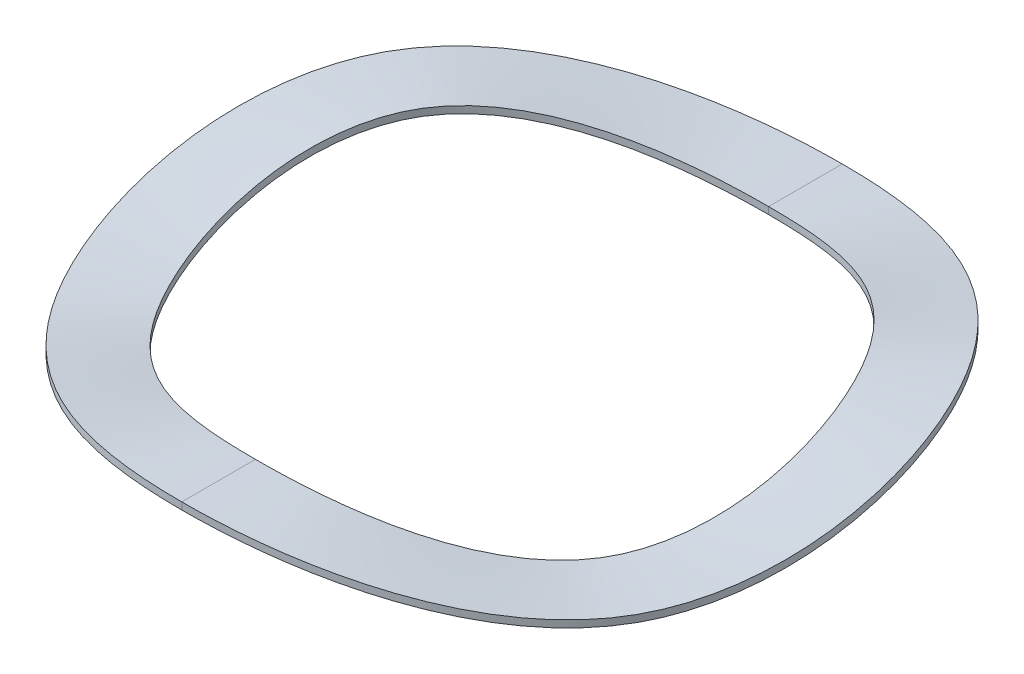
ISO-10303-21;
HEADER;
FILE_DESCRIPTION(('STEP AP214'),'2;1');
FILE_NAME('part.step','',(''),(''),'','','');
FILE_SCHEMA(('AUTOMOTIVE_DESIGN { 1 0 10303 214 1 1 1 1 }'));
ENDSEC;
DATA;
#1=APPLICATION_CONTEXT('core data for automotive mechanical design processes');
#2=APPLICATION_PROTOCOL_DEFINITION('international standard','automotive_design',2000,#1);
#3=PRODUCT_CONTEXT('',#1,'mechanical');
#4=PRODUCT('Part','Part','',(#3));
#5=PRODUCT_RELATED_PRODUCT_CATEGORY('part','',(#4));
#6=PRODUCT_DEFINITION_FORMATION('','',#4);
#7=PRODUCT_DEFINITION_CONTEXT('part definition',#1,'design');
#8=PRODUCT_DEFINITION('design','',#6,#7);
#9=PRODUCT_DEFINITION_SHAPE('','',#8);
#10=(LENGTH_UNIT() NAMED_UNIT(*) SI_UNIT(.MILLI.,.METRE.));
#11=(NAMED_UNIT(*) PLANE_ANGLE_UNIT() SI_UNIT($,.RADIAN.));
#12=(NAMED_UNIT(*) SI_UNIT($,.STERADIAN.) SOLID_ANGLE_UNIT());
#13=UNCERTAINTY_MEASURE_WITH_UNIT(LENGTH_MEASURE(1.E-05),#10,'distance_accuracy_value','');
#14=(GEOMETRIC_REPRESENTATION_CONTEXT(3) GLOBAL_UNCERTAINTY_ASSIGNED_CONTEXT((#13)) GLOBAL_UNIT_ASSIGNED_CONTEXT((#10,
#11,#12)) REPRESENTATION_CONTEXT('',''));
#15=CARTESIAN_POINT('',(0.,0.,0.));
#16=DIRECTION('',(0.,0.,1.));
#17=DIRECTION('',(1.,0.,0.));
#18=AXIS2_PLACEMENT_3D('',#15,#16,#17);
#19=CARTESIAN_POINT('',(0.224188784215286,1.56013019364219,10.5914410143578));
#20=CARTESIAN_POINT('',(0.246642242252223,1.56013019364219,11.6522187744871));
#21=CARTESIAN_POINT('',(0.269095700289108,1.56013019364219,12.712996534619));
#22=CARTESIAN_POINT('',(0.291549158325968,1.56013019364219,13.7737742947509));
#23=CARTESIAN_POINT('',(0.149469520383755,1.56145219262379,10.5932073203959));
#24=CARTESIAN_POINT('',(0.164439527092526,1.56145219262379,11.65416198357));
#25=CARTESIAN_POINT('',(0.179409533801297,1.56145219262379,12.7151166467466));
#26=CARTESIAN_POINT('',(0.194379540510068,1.56145219262379,13.7760713099232));
#27=CARTESIAN_POINT('',(-3.59516428215896,1.59391100285005,10.6372341339144));
#28=CARTESIAN_POINT('',(-3.95523524033666,1.59391100285005,11.7025982692829));
#29=CARTESIAN_POINT('',(-4.3153061985169,1.59391100285005,12.7679624046515));
#30=CARTESIAN_POINT('',(-4.6753771566946,1.59391100285005,13.8333265400201));
#31=CARTESIAN_POINT('',(-11.0096971270514,-1.5621,6.3564516));
#32=CARTESIAN_POINT('',(-12.1123650116503,-1.5621,6.9930772));
#33=CARTESIAN_POINT('',(-13.2150328962517,-1.5621,7.6297028));
#34=CARTESIAN_POINT('',(-14.3177007808505,-1.5621,8.2663284));
#35=CARTESIAN_POINT('',(-11.0096971270514,3.1242,-6.3564516));
#36=CARTESIAN_POINT('',(-12.1123650116503,3.1242,-6.9930772));
#37=CARTESIAN_POINT('',(-13.2150328962517,3.1242,-7.6297028));
#38=CARTESIAN_POINT('',(-14.3177007808505,3.1242,-8.2663284));
#39=CARTESIAN_POINT('',(-3.59516423812044,-0.0318110215952794,-10.6372341593398));
#40=CARTESIAN_POINT('',(-3.9552351918887,-0.0318110215952794,-11.702598297256));
#41=CARTESIAN_POINT('',(-4.31530614565696,-0.0318110215952794,-12.7679624351696));
#42=CARTESIAN_POINT('',(-4.67537709942522,-0.0318110215952794,-13.8333265730832));
#43=CARTESIAN_POINT('',(0.149469608461328,0.000647808139641734,-10.5932073193596));
#44=CARTESIAN_POINT('',(0.164439623991443,0.000647808139641734,-11.6541619824321));
#45=CARTESIAN_POINT('',(0.179409639521558,0.00064780813964148,-12.7151166455045));
#46=CARTESIAN_POINT('',(0.194379655051673,0.00064780813964148,-13.7760713085744));
#47=CARTESIAN_POINT('',(0.224188916304278,0.00196980869486241,-10.5914410112336));
#48=CARTESIAN_POINT('',(0.246642387570474,0.00196980869486241,-11.6522187710531));
#49=CARTESIAN_POINT('',(0.26909585883667,0.00196980869486216,-12.7129965308725));
#50=CARTESIAN_POINT('',(0.291549330102866,0.00196980869486216,-13.7737742906894));
#51=B_SPLINE_SURFACE_WITH_KNOTS('',3,3,((#19,#20,#21,#22),(#23,#24,#25,#26),(#27,#28,#29,#30),
(#31,#32,#33,#34),(#35,#36,#37,#38),(#39,#40,#41,#42),(#43,#44,#45,#46),(#47,#48,#49,#50)),
.UNSPECIFIED.,.F.,.F.,.F.,(4,1,1,1,1,4),(4,4),(-0.00678808502445,0.,0.3333333333333,
0.6666666666667,1.,1.006788089024),(-0.02,1.02),.UNSPECIFIED.);
#52=CARTESIAN_POINT('',(0.184156371888475,1.56132448153225,13.7146292397519));
#53=CARTESIAN_POINT('',(0.122774330257402,1.5618392479152,13.7155420939003));
#54=CARTESIAN_POINT('',(-4.68997461019458,1.58228219095533,13.7514418963119));
#55=CARTESIAN_POINT('',(-14.2540853259684,-1.5621,8.2296));
#56=CARTESIAN_POINT('',(-14.2540853259684,3.12420000000004,-8.2296));
#57=CARTESIAN_POINT('',(-4.68997461019458,-0.0201821909553515,-13.7514418963119));
#58=CARTESIAN_POINT('',(0.122774330257402,0.000260752084858521,-13.7155420939003));
#59=CARTESIAN_POINT('',(0.184156371888475,0.000775518467790328,-13.7146292397519));
#60=B_SPLINE_CURVE_WITH_KNOTS('',3,(#52,#53,#54,#55,#56,#57,#58,#59),.UNSPECIFIED.,.F.,.F.,(4,1,
1,1,1,4),(0.4978466817153,0.5,0.6666666666667,0.8333333333333,1.,1.002153318285),.UNSPECIFIED.);
#61=CARTESIAN_POINT('',(0.,0.,-13.7160000000005));
#62=VERTEX_POINT('',#61);
#63=CARTESIAN_POINT('',(-4.81075523399174E-08,1.5621,13.7160000000005));
#64=VERTEX_POINT('',#63);
#65=EDGE_CURVE('E22',#62,#64,#60,.F.);
#66=DIRECTION('',(0.,0.,1.));
#67=VECTOR('',#66,1.);
#68=CARTESIAN_POINT('',(0.,0.,-12.18565));
#69=LINE('',#68,#67);
#70=CARTESIAN_POINT('',(0.,0.,-10.6553000000007));
#71=VERTEX_POINT('',#70);
#72=EDGE_CURVE('E73',#62,#71,#69,.T.);
#73=CARTESIAN_POINT('',(0.112747999612567,1.56161744192605,10.6546383064847));
#74=CARTESIAN_POINT('',(0.0751666319023766,1.56193804796379,10.6550790605562));
#75=CARTESIAN_POINT('',(-3.65352087802618,1.57800551086132,10.6769987375803));
#76=CARTESIAN_POINT('',(-11.0733125819335,-1.56209999999994,6.39318));
#77=CARTESIAN_POINT('',(-11.0733125819335,3.1242000000001,-6.39318));
#78=CARTESIAN_POINT('',(-3.65352087802618,-0.0159055108612102,-10.6769987375803));
#79=CARTESIAN_POINT('',(0.0751666319023766,0.000161952036260977,-10.6550790605562));
#80=CARTESIAN_POINT('',(0.112747999612567,0.000482558074143377,-10.6546383064847));
#81=B_SPLINE_CURVE_WITH_KNOTS('',3,(#73,#74,#75,#76,#77,#78,#79,#80),.UNSPECIFIED.,.F.,.F.,(4,1,
1,1,1,4),(0.4983029777371,0.5,0.6666666666667,0.8333333333333,1.,1.001697022263),.UNSPECIFIED.);
#82=CARTESIAN_POINT('',(-4.98299081496668E-08,1.56209999999998,10.6553000000007));
#83=VERTEX_POINT('',#82);
#84=EDGE_CURVE('E65',#83,#71,#81,.T.);
#85=DIRECTION('',(-4.6765521799251E-09,0.,1.));
#86=VECTOR('',#85,1.);
#87=CARTESIAN_POINT('',(-5.69866692622103E-08,1.56210000000001,12.18565));
#88=LINE('',#87,#86);
#89=EDGE_CURVE('E71',#83,#64,#88,.T.);
#90=ORIENTED_EDGE('',*,*,#65,.F.);
#91=ORIENTED_EDGE('',*,*,#72,.T.);
#92=ORIENTED_EDGE('',*,*,#84,.F.);
#93=ORIENTED_EDGE('',*,*,#89,.T.);
#94=EDGE_LOOP('',(#90,#91,#92,#93));
#95=FACE_BOUND('',#94,.T.);
#96=ADVANCED_FACE('F16',(#95),#51,.F.);
#97=CARTESIAN_POINT('',(0.184156371888475,1.55548248153224,13.7146292397519));
#98=CARTESIAN_POINT('',(0.122774330257402,1.55599724791521,13.7155420939003));
#99=CARTESIAN_POINT('',(-4.68997461019458,1.57644019095532,13.7514418963119));
#100=CARTESIAN_POINT('',(-14.2540853259684,-1.567942,8.2296));
#101=CARTESIAN_POINT('',(-14.2540853259684,3.118358,-8.2296));
#102=CARTESIAN_POINT('',(-4.68997461019458,-0.0260241909553494,-13.7514418963119));
#103=CARTESIAN_POINT('',(0.122774330257402,-0.00558124791513996,-13.7155420939003));
#104=CARTESIAN_POINT('',(0.184156371888475,-0.00506648153220844,-13.7146292397519));
#105=CARTESIAN_POINT('',(0.184156371888475,1.65674381486566,13.7146292397519));
#106=CARTESIAN_POINT('',(0.122774330257402,1.65725858124837,13.7155420939003));
#107=CARTESIAN_POINT('',(-4.68997461019458,1.67770152428874,13.7514418963119));
#108=CARTESIAN_POINT('',(-14.2540853259684,-1.46668066666658,8.2296));
#109=CARTESIAN_POINT('',(-14.2540853259684,3.21961933333418,-8.2296));
#110=CARTESIAN_POINT('',(-4.68997461019458,0.075237142377967,-13.7514418963119));
#111=CARTESIAN_POINT('',(0.122774330257402,0.0956800854181866,-13.7155420939003));
#112=CARTESIAN_POINT('',(0.184156371888475,0.0961948518011232,-13.7146292397519));
#113=CARTESIAN_POINT('',(0.184156371888475,1.75800514819883,13.7146292397519));
#114=CARTESIAN_POINT('',(0.122774330257402,1.75851991458179,13.7155420939003));
#115=CARTESIAN_POINT('',(-4.68997461019458,1.77896285762191,13.7514418963119));
#116=CARTESIAN_POINT('',(-14.2540853259684,-1.36541933333342,8.2296));
#117=CARTESIAN_POINT('',(-14.2540853259684,3.32088066666582,-8.2296));
#118=CARTESIAN_POINT('',(-4.68997461019458,0.176498475711309,-13.7514418963119));
#119=CARTESIAN_POINT('',(0.122774330257402,0.196941418751528,-13.7155420939003));
#120=CARTESIAN_POINT('',(0.184156371888475,0.197456185134465,-13.7146292397519));
#121=CARTESIAN_POINT('',(0.184156371888475,1.85926648153224,13.7146292397519));
#122=CARTESIAN_POINT('',(0.122774330257402,1.85978124791521,13.7155420939003));
#123=CARTESIAN_POINT('',(-4.68997461019458,1.88022419095532,13.7514418963119));
#124=CARTESIAN_POINT('',(-14.2540853259684,-1.264158,8.2296));
#125=CARTESIAN_POINT('',(-14.2540853259684,3.422142,-8.2296));
#126=CARTESIAN_POINT('',(-4.68997461019458,0.277759809044676,-13.7514418963119));
#127=CARTESIAN_POINT('',(0.122774330257402,0.298202752084794,-13.7155420939003));
#128=CARTESIAN_POINT('',(0.184156371888475,0.298717518467756,-13.7146292397519));
#129=B_SPLINE_SURFACE_WITH_KNOTS('',3,3,((#97,#98,#99,#100,#101,#102,#103,#104),(#105,#106,#107,
#108,#109,#110,#111,#112),(#113,#114,#115,#116,#117,#118,#119,#120),(#121,#122,#123,#124,#125,
#126,#127,#128)),.UNSPECIFIED.,.F.,.F.,.F.,(4,4),(4,1,1,1,1,4),(-0.02,1.02),(0.4978466817153,
0.5,0.6666666666667,0.8333333333333,1.,1.002153318285),.UNSPECIFIED.);
#130=DIRECTION('',(0.,-1.,0.));
#131=VECTOR('',#130,1.);
#132=CARTESIAN_POINT('',(0.,0.146049999999991,-13.7160000000005));
#133=LINE('',#132,#131);
#134=CARTESIAN_POINT('',(0.,0.292099999999941,-13.7160000000005));
#135=VERTEX_POINT('',#134);
#136=EDGE_CURVE('E38',#135,#62,#133,.T.);
#137=DIRECTION('',(0.,1.,0.));
#138=VECTOR('',#137,1.);
#139=CARTESIAN_POINT('',(-4.27622595601009E-08,1.70814999999997,13.7160000000005));
#140=LINE('',#139,#138);
#141=CARTESIAN_POINT('',(-4.27622595601009E-08,1.85420000000006,13.7160000000005));
#142=VERTEX_POINT('',#141);
#143=EDGE_CURVE('E60',#64,#142,#140,.T.);
#144=CARTESIAN_POINT('',(0.184156371888475,1.85342448153218,13.7146292397519));
#145=CARTESIAN_POINT('',(0.122774330257402,1.85393924791514,13.7155420939003));
#146=CARTESIAN_POINT('',(-4.68997461019458,1.87438219095526,13.7514418963119));
#147=CARTESIAN_POINT('',(-14.2540853259684,-1.27000000000006,8.2296));
#148=CARTESIAN_POINT('',(-14.2540853259684,3.41629999999989,-8.2296));
#149=CARTESIAN_POINT('',(-4.68997461019458,0.271917809044616,-13.7514418963119));
#150=CARTESIAN_POINT('',(0.122774330257402,0.292360752084739,-13.7155420939003));
#151=CARTESIAN_POINT('',(0.184156371888475,0.2928755184677,-13.7146292397519));
#152=B_SPLINE_CURVE_WITH_KNOTS('',3,(#144,#145,#146,#147,#148,#149,#150,#151),.UNSPECIFIED.,.F.,
.F.,(4,1,1,1,1,4),(0.4978466817153,0.5,0.6666666666667,0.8333333333333,1.,1.002153318285),.UNSPECIFIED.);
#153=EDGE_CURVE('E108',#142,#135,#152,.T.);
#154=ORIENTED_EDGE('',*,*,#136,.T.);
#155=ORIENTED_EDGE('',*,*,#65,.T.);
#156=ORIENTED_EDGE('',*,*,#143,.T.);
#157=ORIENTED_EDGE('',*,*,#153,.T.);
#158=EDGE_LOOP('',(#154,#155,#156,#157));
#159=FACE_BOUND('',#158,.T.);
#160=ADVANCED_FACE('F58',(#159),#129,.T.);
#161=CARTESIAN_POINT('',(0.112747999612567,1.859559441926,10.6546383064847));
#162=CARTESIAN_POINT('',(0.0751666319023766,1.85988004796373,10.6550790605562));
#163=CARTESIAN_POINT('',(-3.65352087802618,1.87594751086125,10.6769987375803));
#164=CARTESIAN_POINT('',(-11.0733125819335,-1.264158,6.39318));
#165=CARTESIAN_POINT('',(-11.0733125819335,3.422142,-6.39318));
#166=CARTESIAN_POINT('',(-3.65352087802618,0.282036489138746,-10.6769987375803));
#167=CARTESIAN_POINT('',(0.0751666319023766,0.298103952036268,-10.6550790605562));
#168=CARTESIAN_POINT('',(0.112747999612567,0.298424558073998,-10.6546383064847));
#169=CARTESIAN_POINT('',(0.112747999612567,1.75829810859258,10.6546383064847));
#170=CARTESIAN_POINT('',(0.0751666319023766,1.75861871463057,10.6550790605562));
#171=CARTESIAN_POINT('',(-3.65352087802618,1.77468617752784,10.6769987375803));
#172=CARTESIAN_POINT('',(-11.0733125819335,-1.36541933333342,6.39318));
#173=CARTESIAN_POINT('',(-11.0733125819335,3.32088066666582,-6.39318));
#174=CARTESIAN_POINT('',(-3.65352087802618,0.180775155805404,-10.6769987375803));
#175=CARTESIAN_POINT('',(0.0751666319023766,0.196842618702875,-10.6550790605562));
#176=CARTESIAN_POINT('',(0.112747999612567,0.197163224740758,-10.6546383064847));
#177=CARTESIAN_POINT('',(0.112747999612567,1.65703677525917,10.6546383064847));
#178=CARTESIAN_POINT('',(0.0751666319023766,1.65735738129715,10.6550790605562));
#179=CARTESIAN_POINT('',(-3.65352087802618,1.67342484419467,10.6769987375803));
#180=CARTESIAN_POINT('',(-11.0733125819335,-1.46668066666658,6.39318));
#181=CARTESIAN_POINT('',(-11.0733125819335,3.21961933333418,-6.39318));
#182=CARTESIAN_POINT('',(-3.65352087802618,0.0795138224720624,-10.6769987375803));
#183=CARTESIAN_POINT('',(0.0751666319023766,0.0955812853695336,-10.6550790605562));
#184=CARTESIAN_POINT('',(0.112747999612567,0.095901891407416,-10.6546383064847));
#185=CARTESIAN_POINT('',(0.112747999612567,1.555775441926,10.6546383064847));
#186=CARTESIAN_POINT('',(0.0751666319023766,1.55609604796373,10.6550790605562));
#187=CARTESIAN_POINT('',(-3.65352087802618,1.57216351086125,10.6769987375803));
#188=CARTESIAN_POINT('',(-11.0733125819335,-1.567942,6.39318));
#189=CARTESIAN_POINT('',(-11.0733125819335,3.118358,-6.39318));
#190=CARTESIAN_POINT('',(-3.65352087802618,-0.0217475108612667,-10.6769987375803));
#191=CARTESIAN_POINT('',(0.0751666319023766,-0.0056800479637955,-10.6550790605562));
#192=CARTESIAN_POINT('',(0.112747999612567,-0.0053594419259131,-10.6546383064847));
#193=B_SPLINE_SURFACE_WITH_KNOTS('',3,3,((#161,#162,#163,#164,#165,#166,#167,#168),(#169,#170,
#171,#172,#173,#174,#175,#176),(#177,#178,#179,#180,#181,#182,#183,#184),(#185,#186,#187,#188,
#189,#190,#191,#192)),.UNSPECIFIED.,.F.,.F.,.F.,(4,4),(4,1,1,1,1,4),(-0.02,1.02),
(0.4983029777371,0.5,0.6666666666667,0.8333333333333,1.,1.001697022263),.UNSPECIFIED.);
#194=DIRECTION('',(0.,-1.,0.));
#195=VECTOR('',#194,1.);
#196=CARTESIAN_POINT('',(0.,0.146050000000006,-10.6553000000007));
#197=LINE('',#196,#195);
#198=CARTESIAN_POINT('',(0.,0.292100000000058,-10.6553000000007));
#199=VERTEX_POINT('',#198);
#200=EDGE_CURVE('E122',#199,#71,#197,.T.);
#201=CARTESIAN_POINT('',(0.112747999612567,1.85371744192594,10.6546383064847));
#202=CARTESIAN_POINT('',(0.0751666319023766,1.85403804796368,10.6550790605562));
#203=CARTESIAN_POINT('',(-3.65352087802618,1.87010551086119,10.6769987375803));
#204=CARTESIAN_POINT('',(-11.0733125819335,-1.27000000000006,6.39318));
#205=CARTESIAN_POINT('',(-11.0733125819335,3.4162999999999,-6.39318));
#206=CARTESIAN_POINT('',(-3.65352087802618,0.276194489138688,-10.6769987375803));
#207=CARTESIAN_POINT('',(0.0751666319023766,0.292261952036207,-10.6550790605562));
#208=CARTESIAN_POINT('',(0.112747999612567,0.292582558073946,-10.6546383064847));
#209=B_SPLINE_CURVE_WITH_KNOTS('',3,(#201,#202,#203,#204,#205,#206,#207,#208),.UNSPECIFIED.,.F.,
.F.,(4,1,1,1,1,4),(0.4983029777371,0.5,0.6666666666667,0.8333333333333,1.,1.001697022263),.UNSPECIFIED.);
#210=CARTESIAN_POINT('',(-4.15249231910151E-08,1.85419999999995,10.6553000000007));
#211=VERTEX_POINT('',#210);
#212=EDGE_CURVE('E75',#199,#211,#209,.F.);
#213=DIRECTION('',(0.,1.,0.));
#214=VECTOR('',#213,1.);
#215=CARTESIAN_POINT('',(-4.98299084420518E-08,1.70815000000003,10.6553000000007));
#216=LINE('',#215,#214);
#217=EDGE_CURVE('E115',#83,#211,#216,.T.);
#218=ORIENTED_EDGE('',*,*,#200,.F.);
#219=ORIENTED_EDGE('',*,*,#212,.T.);
#220=ORIENTED_EDGE('',*,*,#217,.F.);
#221=ORIENTED_EDGE('',*,*,#84,.T.);
#222=EDGE_LOOP('',(#218,#219,#220,#221));
#223=FACE_BOUND('',#222,.T.);
#224=ADVANCED_FACE('F134',(#223),#193,.T.);
#225=CARTESIAN_POINT('',(-0.224188917200898,0.00196980871072624,-10.5914410112133));
#226=CARTESIAN_POINT('',(-0.246642388556908,0.00196980871072624,-11.6522187710302));
#227=CARTESIAN_POINT('',(-0.269095859912868,0.00196980871072624,-12.7129965308471));
#228=CARTESIAN_POINT('',(-0.29154933126898,0.00196980871072649,-13.7737742906615));
#229=CARTESIAN_POINT('',(-0.149469609059193,0.000647808144823842,-10.593207319352));
#230=CARTESIAN_POINT('',(-0.164439624649201,0.000647808144824096,-11.6541619824244));
#231=CARTESIAN_POINT('',(-0.179409640239209,0.000647808144824096,-12.7151166454944));
#232=CARTESIAN_POINT('',(-0.194379655829192,0.000647808144824096,-13.7760713085668));
#233=CARTESIAN_POINT('',(3.59516423782072,-0.031811021722508,-10.6372341595125));
#234=CARTESIAN_POINT('',(3.9552351915585,-0.031811021722508,-11.7025982974439));
#235=CARTESIAN_POINT('',(4.31530614529628,-0.031811021722508,-12.7679624353779));
#236=CARTESIAN_POINT('',(4.67537709903406,-0.031811021722508,-13.8333265733093));
#237=CARTESIAN_POINT('',(11.0096971270514,3.1242,-6.3564516));
#238=CARTESIAN_POINT('',(12.1123650116503,3.1242,-6.9930772));
#239=CARTESIAN_POINT('',(13.2150328962517,3.1242,-7.6297028));
#240=CARTESIAN_POINT('',(14.3177007808505,3.1242,-8.2663284));
#241=CARTESIAN_POINT('',(11.0096971270514,-1.5621,6.3564516));
#242=CARTESIAN_POINT('',(12.1123650116503,-1.5621,6.9930772));
#243=CARTESIAN_POINT('',(13.2150328962517,-1.5621,7.6297028));
#244=CARTESIAN_POINT('',(14.3177007808505,-1.5621,8.2663284));
#245=CARTESIAN_POINT('',(3.59516423782072,1.59391102172251,10.6372341595125));
#246=CARTESIAN_POINT('',(3.9552351915585,1.59391102172251,11.7025982974439));
#247=CARTESIAN_POINT('',(4.31530614529628,1.59391102172251,12.7679624353779));
#248=CARTESIAN_POINT('',(4.67537709903406,1.59391102172251,13.8333265733093));
#249=CARTESIAN_POINT('',(-0.149469609059193,1.56145219185518,10.593207319352));
#250=CARTESIAN_POINT('',(-0.164439624649201,1.56145219185518,11.6541619824244));
#251=CARTESIAN_POINT('',(-0.179409640239209,1.56145219185518,12.7151166454944));
#252=CARTESIAN_POINT('',(-0.194379655829192,1.56145219185518,13.7760713085668));
#253=CARTESIAN_POINT('',(-0.224188917200898,1.56013019128938,10.5914410112133));
#254=CARTESIAN_POINT('',(-0.246642388556883,1.56013019128938,11.6522187710302));
#255=CARTESIAN_POINT('',(-0.269095859912868,1.56013019128938,12.7129965308471));
#256=CARTESIAN_POINT('',(-0.29154933126898,1.56013019128938,13.7737742906615));
#257=B_SPLINE_SURFACE_WITH_KNOTS('',3,3,((#225,#226,#227,#228),(#229,#230,#231,#232),(#233,#234,
#235,#236),(#237,#238,#239,#240),(#241,#242,#243,#244),(#245,#246,#247,#248),(#249,#250,#251,
#252),(#253,#254,#255,#256)),.UNSPECIFIED.,.F.,.F.,.F.,(4,1,1,1,1,4),(4,4),(-0.006788089051602,
0.,0.3333333333333,0.6666666666667,1.,1.006788089052),(-0.02,1.02),.UNSPECIFIED.);
#258=CARTESIAN_POINT('',(-0.18415637188845,0.000775518467738626,-13.7146292397519));
#259=CARTESIAN_POINT('',(-0.122774330257402,0.000260752084804422,-13.7155420939003));
#260=CARTESIAN_POINT('',(4.68997461019458,-0.0201821909554032,-13.7514418963119));
#261=CARTESIAN_POINT('',(14.2540853259684,3.12419999999999,-8.2296));
#262=CARTESIAN_POINT('',(14.2540853259684,-1.56210000000005,8.2296));
#263=CARTESIAN_POINT('',(4.68997461019458,1.58228219095528,13.7514418963119));
#264=CARTESIAN_POINT('',(-0.122774330257402,1.56183924791514,13.7155420939003));
#265=CARTESIAN_POINT('',(-0.18415637188845,1.5613244815322,13.7146292397519));
#266=B_SPLINE_CURVE_WITH_KNOTS('',3,(#258,#259,#260,#261,#262,#263,#264,#265),.UNSPECIFIED.,.F.,
.F.,(4,1,1,1,1,4),(-0.002153318284719,0.,0.1666666666667,0.3333333333333,0.5,0.5021533182847),.UNSPECIFIED.);
#267=EDGE_CURVE('E68',#64,#62,#266,.F.);
#268=CARTESIAN_POINT('',(-0.112747999612567,0.000482558074088672,-10.6546383064847));
#269=CARTESIAN_POINT('',(-0.0751666319023766,0.000161952036206273,-10.6550790605562));
#270=CARTESIAN_POINT('',(3.65352087802618,-0.0159055108612601,-10.6769987375803));
#271=CARTESIAN_POINT('',(11.0733125819335,3.12420000000005,-6.39318));
#272=CARTESIAN_POINT('',(11.0733125819335,-1.56209999999999,6.39318));
#273=CARTESIAN_POINT('',(3.65352087802618,1.57800551086126,10.6769987375803));
#274=CARTESIAN_POINT('',(-0.075166631902402,1.56193804796374,10.6550790605562));
#275=CARTESIAN_POINT('',(-0.112747999612592,1.56161744192599,10.6546383064847));
#276=B_SPLINE_CURVE_WITH_KNOTS('',3,(#268,#269,#270,#271,#272,#273,#274,#275),.UNSPECIFIED.,.F.,
.F.,(4,1,1,1,1,4),(-0.001697022262901,0.,0.1666666666667,0.3333333333333,0.5,0.5016970222629),.UNSPECIFIED.);
#277=EDGE_CURVE('E116',#71,#83,#276,.T.);
#278=ORIENTED_EDGE('',*,*,#72,.F.);
#279=ORIENTED_EDGE('',*,*,#267,.F.);
#280=ORIENTED_EDGE('',*,*,#89,.F.);
#281=ORIENTED_EDGE('',*,*,#277,.F.);
#282=EDGE_LOOP('',(#278,#279,#280,#281));
#283=FACE_BOUND('',#282,.T.);
#284=ADVANCED_FACE('F69',(#283),#257,.F.);
#285=CARTESIAN_POINT('',(-0.112747999612567,0.298424558073998,-10.6546383064847));
#286=CARTESIAN_POINT('',(-0.0751666319023766,0.298103952036268,-10.6550790605562));
#287=CARTESIAN_POINT('',(3.65352087802618,0.282036489138746,-10.6769987375803));
#288=CARTESIAN_POINT('',(11.0733125819335,3.422142,-6.39318));
#289=CARTESIAN_POINT('',(11.0733125819335,-1.264158,6.39318));
#290=CARTESIAN_POINT('',(3.65352087802618,1.87594751086125,10.6769987375803));
#291=CARTESIAN_POINT('',(-0.075166631902402,1.85988004796373,10.6550790605562));
#292=CARTESIAN_POINT('',(-0.112747999612592,1.859559441926,10.6546383064847));
#293=CARTESIAN_POINT('',(-0.112747999612567,0.197163224740758,-10.6546383064847));
#294=CARTESIAN_POINT('',(-0.0751666319023766,0.196842618702875,-10.6550790605562));
#295=CARTESIAN_POINT('',(3.65352087802618,0.180775155805404,-10.6769987375803));
#296=CARTESIAN_POINT('',(11.0733125819335,3.32088066666582,-6.39318));
#297=CARTESIAN_POINT('',(11.0733125819335,-1.36541933333342,6.39318));
#298=CARTESIAN_POINT('',(3.65352087802618,1.77468617752784,10.6769987375803));
#299=CARTESIAN_POINT('',(-0.075166631902402,1.75861871463057,10.6550790605562));
#300=CARTESIAN_POINT('',(-0.112747999612592,1.75829810859258,10.6546383064847));
#301=CARTESIAN_POINT('',(-0.112747999612567,0.095901891407416,-10.6546383064847));
#302=CARTESIAN_POINT('',(-0.0751666319023766,0.0955812853695336,-10.6550790605562));
#303=CARTESIAN_POINT('',(3.65352087802618,0.0795138224720624,-10.6769987375803));
#304=CARTESIAN_POINT('',(11.0733125819335,3.21961933333418,-6.39318));
#305=CARTESIAN_POINT('',(11.0733125819335,-1.46668066666658,6.39318));
#306=CARTESIAN_POINT('',(3.65352087802618,1.67342484419467,10.6769987375803));
#307=CARTESIAN_POINT('',(-0.075166631902402,1.65735738129715,10.6550790605562));
#308=CARTESIAN_POINT('',(-0.112747999612592,1.65703677525917,10.6546383064847));
#309=CARTESIAN_POINT('',(-0.112747999612567,-0.0053594419259131,-10.6546383064847));
#310=CARTESIAN_POINT('',(-0.0751666319023766,-0.0056800479637955,-10.6550790605562));
#311=CARTESIAN_POINT('',(3.65352087802618,-0.0217475108612616,-10.6769987375803));
#312=CARTESIAN_POINT('',(11.0733125819335,3.118358,-6.39318));
#313=CARTESIAN_POINT('',(11.0733125819335,-1.567942,6.39318));
#314=CARTESIAN_POINT('',(3.65352087802618,1.57216351086125,10.6769987375803));
#315=CARTESIAN_POINT('',(-0.075166631902402,1.55609604796373,10.6550790605562));
#316=CARTESIAN_POINT('',(-0.112747999612592,1.555775441926,10.6546383064847));
#317=B_SPLINE_SURFACE_WITH_KNOTS('',3,3,((#285,#286,#287,#288,#289,#290,#291,#292),(#293,#294,
#295,#296,#297,#298,#299,#300),(#301,#302,#303,#304,#305,#306,#307,#308),(#309,#310,#311,#312,
#313,#314,#315,#316)),.UNSPECIFIED.,.F.,.F.,.F.,(4,4),(4,1,1,1,1,4),(-0.02,1.02),
(-0.001697022262901,0.,0.1666666666667,0.3333333333333,0.5,0.5016970222629),.UNSPECIFIED.);
#318=CARTESIAN_POINT('',(-0.112747999612567,0.292582558074055,-10.6546383064847));
#319=CARTESIAN_POINT('',(-0.0751666319023766,0.292261952036317,-10.6550790605562));
#320=CARTESIAN_POINT('',(3.65352087802618,0.276194489138798,-10.6769987375803));
#321=CARTESIAN_POINT('',(11.0733125819335,3.41630000000001,-6.39318));
#322=CARTESIAN_POINT('',(11.0733125819335,-1.26999999999995,6.39318));
#323=CARTESIAN_POINT('',(3.65352087802618,1.8701055108613,10.6769987375803));
#324=CARTESIAN_POINT('',(-0.075166631902402,1.85403804796379,10.6550790605562));
#325=CARTESIAN_POINT('',(-0.112747999612592,1.85371744192605,10.6546383064847));
#326=B_SPLINE_CURVE_WITH_KNOTS('',3,(#318,#319,#320,#321,#322,#323,#324,#325),.UNSPECIFIED.,.F.,
.F.,(4,1,1,1,1,4),(-0.001697022262901,0.,0.1666666666667,0.3333333333333,0.5,0.5016970222629),.UNSPECIFIED.);
#327=EDGE_CURVE('E88',#211,#199,#326,.F.);
#328=ORIENTED_EDGE('',*,*,#277,.T.);
#329=ORIENTED_EDGE('',*,*,#217,.T.);
#330=ORIENTED_EDGE('',*,*,#327,.T.);
#331=ORIENTED_EDGE('',*,*,#200,.T.);
#332=EDGE_LOOP('',(#328,#329,#330,#331));
#333=FACE_BOUND('',#332,.T.);
#334=ADVANCED_FACE('F138',(#333),#317,.T.);
#335=CARTESIAN_POINT('',(0.291549158325968,1.85223019364219,13.7737742947509));
#336=CARTESIAN_POINT('',(0.269095700289108,1.85223019364219,12.712996534619));
#337=CARTESIAN_POINT('',(0.246642242252223,1.85223019364219,11.6522187744871));
#338=CARTESIAN_POINT('',(0.224188784215312,1.85223019364219,10.5914410143578));
#339=CARTESIAN_POINT('',(0.194379540510068,1.85355219262379,13.7760713099232));
#340=CARTESIAN_POINT('',(0.179409533801297,1.85355219262379,12.7151166467466));
#341=CARTESIAN_POINT('',(0.164439527092526,1.85355219262379,11.65416198357));
#342=CARTESIAN_POINT('',(0.149469520383755,1.85355219262379,10.5932073203959));
#343=CARTESIAN_POINT('',(-4.6753771566946,1.88601100285005,13.8333265400201));
#344=CARTESIAN_POINT('',(-4.3153061985169,1.88601100285005,12.7679624046515));
#345=CARTESIAN_POINT('',(-3.95523524033666,1.88601100285005,11.7025982692829));
#346=CARTESIAN_POINT('',(-3.59516428215896,1.88601100285005,10.6372341339144));
#347=CARTESIAN_POINT('',(-14.3177007808505,-1.27,8.2663284));
#348=CARTESIAN_POINT('',(-13.2150328962517,-1.27,7.6297028));
#349=CARTESIAN_POINT('',(-12.1123650116528,-1.27,6.9930772));
#350=CARTESIAN_POINT('',(-11.0096971270514,-1.27,6.3564516));
#351=CARTESIAN_POINT('',(-14.3177007808505,3.4163,-8.2663284));
#352=CARTESIAN_POINT('',(-13.2150328962517,3.4163,-7.6297028));
#353=CARTESIAN_POINT('',(-12.1123650116503,3.4163,-6.9930772));
#354=CARTESIAN_POINT('',(-11.0096971270514,3.4163,-6.3564516));
#355=CARTESIAN_POINT('',(-4.67537709942522,0.260288978404746,-13.8333265730832));
#356=CARTESIAN_POINT('',(-4.31530614565696,0.260288978404746,-12.7679624351696));
#357=CARTESIAN_POINT('',(-3.9552351918887,0.260288978404746,-11.702598297256));
#358=CARTESIAN_POINT('',(-3.59516423812044,0.260288978404746,-10.6372341593398));
#359=CARTESIAN_POINT('',(0.194379655051673,0.292747808139738,-13.7760713085744));
#360=CARTESIAN_POINT('',(0.179409639521558,0.292747808139738,-12.7151166455045));
#361=CARTESIAN_POINT('',(0.164439623991443,0.292747808139738,-11.6541619824321));
#362=CARTESIAN_POINT('',(0.149469608461328,0.292747808139738,-10.5932073193596));
#363=CARTESIAN_POINT('',(0.291549330102866,0.294069808694868,-13.7737742906894));
#364=CARTESIAN_POINT('',(0.26909585883667,0.294069808694868,-12.7129965308725));
#365=CARTESIAN_POINT('',(0.246642387570474,0.294069808694868,-11.6522187710531));
#366=CARTESIAN_POINT('',(0.224188916304278,0.294069808694868,-10.5914410112336));
#367=B_SPLINE_SURFACE_WITH_KNOTS('',3,3,((#335,#336,#337,#338),(#339,#340,#341,#342),(#343,#344,
#345,#346),(#347,#348,#349,#350),(#351,#352,#353,#354),(#355,#356,#357,#358),(#359,#360,#361,
#362),(#363,#364,#365,#366)),.UNSPECIFIED.,.F.,.F.,.F.,(4,1,1,1,1,4),(4,4),(-0.00678808502445,
0.,0.3333333333333,0.6666666666667,1.,1.006788089024),(-0.02,1.02),.UNSPECIFIED.);
#368=DIRECTION('',(0.,0.,-1.));
#369=VECTOR('',#368,1.);
#370=CARTESIAN_POINT('',(0.,0.292099999999994,-12.18565));
#371=LINE('',#370,#369);
#372=EDGE_CURVE('E30',#199,#135,#371,.T.);
#373=DIRECTION('',(3.11768127143363E-09,0.,-1.));
#374=VECTOR('',#373,1.);
#375=CARTESIAN_POINT('',(-3.79910941994517E-08,1.85420000000001,12.18565));
#376=LINE('',#375,#374);
#377=EDGE_CURVE('E74',#142,#211,#376,.T.);
#378=ORIENTED_EDGE('',*,*,#212,.F.);
#379=ORIENTED_EDGE('',*,*,#372,.T.);
#380=ORIENTED_EDGE('',*,*,#153,.F.);
#381=ORIENTED_EDGE('',*,*,#377,.T.);
#382=EDGE_LOOP('',(#378,#379,#380,#381));
#383=FACE_BOUND('',#382,.T.);
#384=ADVANCED_FACE('F147',(#383),#367,.F.);
#385=CARTESIAN_POINT('',(-0.18415637188845,-0.00506648153220844,-13.7146292397519));
#386=CARTESIAN_POINT('',(-0.122774330257402,-0.0055812479151425,-13.7155420939003));
#387=CARTESIAN_POINT('',(4.68997461019458,-0.0260241909553494,-13.7514418963119));
#388=CARTESIAN_POINT('',(14.2540853259684,3.118358,-8.2296));
#389=CARTESIAN_POINT('',(14.2540853259684,-1.567942,8.2296));
#390=CARTESIAN_POINT('',(4.68997461019458,1.57644019095532,13.7514418963119));
#391=CARTESIAN_POINT('',(-0.122774330257402,1.55599724791521,13.7155420939003));
#392=CARTESIAN_POINT('',(-0.18415637188845,1.55548248153224,13.7146292397519));
#393=CARTESIAN_POINT('',(-0.18415637188845,0.0961948518011232,-13.7146292397519));
#394=CARTESIAN_POINT('',(-0.122774330257402,0.0956800854181866,-13.7155420939003));
#395=CARTESIAN_POINT('',(4.68997461019458,0.075237142377967,-13.7514418963119));
#396=CARTESIAN_POINT('',(14.2540853259684,3.21961933333418,-8.2296));
#397=CARTESIAN_POINT('',(14.2540853259684,-1.46668066666658,8.2296));
#398=CARTESIAN_POINT('',(4.68997461019458,1.67770152428874,13.7514418963119));
#399=CARTESIAN_POINT('',(-0.122774330257402,1.65725858124837,13.7155420939003));
#400=CARTESIAN_POINT('',(-0.18415637188845,1.65674381486566,13.7146292397519));
#401=CARTESIAN_POINT('',(-0.18415637188845,0.197456185134465,-13.7146292397519));
#402=CARTESIAN_POINT('',(-0.122774330257402,0.196941418751528,-13.7155420939003));
#403=CARTESIAN_POINT('',(4.68997461019458,0.176498475711309,-13.7514418963119));
#404=CARTESIAN_POINT('',(14.2540853259684,3.32088066666582,-8.2296));
#405=CARTESIAN_POINT('',(14.2540853259684,-1.36541933333342,8.2296));
#406=CARTESIAN_POINT('',(4.68997461019458,1.77896285762191,13.7514418963119));
#407=CARTESIAN_POINT('',(-0.122774330257402,1.75851991458179,13.7155420939003));
#408=CARTESIAN_POINT('',(-0.18415637188845,1.75800514819883,13.7146292397519));
#409=CARTESIAN_POINT('',(-0.18415637188845,0.298717518467756,-13.7146292397519));
#410=CARTESIAN_POINT('',(-0.122774330257402,0.298202752084794,-13.7155420939003));
#411=CARTESIAN_POINT('',(4.68997461019458,0.277759809044676,-13.7514418963119));
#412=CARTESIAN_POINT('',(14.2540853259684,3.422142,-8.2296));
#413=CARTESIAN_POINT('',(14.2540853259684,-1.264158,8.2296));
#414=CARTESIAN_POINT('',(4.68997461019458,1.88022419095532,13.7514418963119));
#415=CARTESIAN_POINT('',(-0.122774330257402,1.85978124791521,13.7155420939003));
#416=CARTESIAN_POINT('',(-0.18415637188845,1.85926648153224,13.7146292397519));
#417=B_SPLINE_SURFACE_WITH_KNOTS('',3,3,((#385,#386,#387,#388,#389,#390,#391,#392),(#393,#394,
#395,#396,#397,#398,#399,#400),(#401,#402,#403,#404,#405,#406,#407,#408),(#409,#410,#411,#412,
#413,#414,#415,#416)),.UNSPECIFIED.,.F.,.F.,.F.,(4,4),(4,1,1,1,1,4),(-0.02,1.02),
(-0.002153318284719,0.,0.1666666666667,0.3333333333333,0.5,0.5021533182847),.UNSPECIFIED.);
#418=CARTESIAN_POINT('',(-0.18415637188845,0.292875518467817,-13.7146292397519));
#419=CARTESIAN_POINT('',(-0.122774330257402,0.292360752084856,-13.7155420939003));
#420=CARTESIAN_POINT('',(4.68997461019458,0.271917809044733,-13.7514418963119));
#421=CARTESIAN_POINT('',(14.2540853259684,3.41630000000001,-8.2296));
#422=CARTESIAN_POINT('',(14.2540853259684,-1.26999999999995,8.2296));
#423=CARTESIAN_POINT('',(4.68997461019458,1.87438219095538,13.7514418963119));
#424=CARTESIAN_POINT('',(-0.122774330257402,1.85393924791526,13.7155420939003));
#425=CARTESIAN_POINT('',(-0.18415637188845,1.8534244815323,13.7146292397519));
#426=B_SPLINE_CURVE_WITH_KNOTS('',3,(#418,#419,#420,#421,#422,#423,#424,#425),.UNSPECIFIED.,.F.,
.F.,(4,1,1,1,1,4),(-0.002153318284719,0.,0.1666666666667,0.3333333333333,0.5,0.5021533182847),.UNSPECIFIED.);
#427=EDGE_CURVE('E11',#135,#142,#426,.T.);
#428=ORIENTED_EDGE('',*,*,#427,.T.);
#429=ORIENTED_EDGE('',*,*,#143,.F.);
#430=ORIENTED_EDGE('',*,*,#267,.T.);
#431=ORIENTED_EDGE('',*,*,#136,.F.);
#432=EDGE_LOOP('',(#428,#429,#430,#431));
#433=FACE_BOUND('',#432,.T.);
#434=ADVANCED_FACE('F80',(#433),#417,.T.);
#435=CARTESIAN_POINT('',(-0.29154933126898,0.294069808710616,-13.7737742906615));
#436=CARTESIAN_POINT('',(-0.269095859912868,0.294069808710616,-12.7129965308471));
#437=CARTESIAN_POINT('',(-0.246642388556908,0.294069808710616,-11.6522187710302));
#438=CARTESIAN_POINT('',(-0.224188917200898,0.294069808710616,-10.5914410112133));
#439=CARTESIAN_POINT('',(-0.194379655829192,0.292747808144818,-13.7760713085668));
#440=CARTESIAN_POINT('',(-0.179409640239209,0.292747808144818,-12.7151166454944));
#441=CARTESIAN_POINT('',(-0.164439624649201,0.292747808144818,-11.6541619824244));
#442=CARTESIAN_POINT('',(-0.149469609059193,0.292747808144818,-10.593207319352));
#443=CARTESIAN_POINT('',(4.67537709903406,0.260288978277492,-13.8333265733093));
#444=CARTESIAN_POINT('',(4.31530614529628,0.260288978277492,-12.7679624353779));
#445=CARTESIAN_POINT('',(3.9552351915585,0.260288978277492,-11.7025982974439));
#446=CARTESIAN_POINT('',(3.59516423782072,0.260288978277492,-10.6372341595125));
#447=CARTESIAN_POINT('',(14.3177007808505,3.4163,-8.2663284));
#448=CARTESIAN_POINT('',(13.2150328962517,3.4163,-7.6297028));
#449=CARTESIAN_POINT('',(12.1123650116503,3.4163,-6.9930772));
#450=CARTESIAN_POINT('',(11.0096971270514,3.4163,-6.3564516));
#451=CARTESIAN_POINT('',(14.3177007808505,-1.27,8.2663284));
#452=CARTESIAN_POINT('',(13.2150328962517,-1.27,7.6297028));
#453=CARTESIAN_POINT('',(12.1123650116503,-1.27,6.9930772));
#454=CARTESIAN_POINT('',(11.0096971270514,-1.27,6.3564516));
#455=CARTESIAN_POINT('',(4.67537709903406,1.88601102172251,13.8333265733093));
#456=CARTESIAN_POINT('',(4.31530614529628,1.88601102172251,12.7679624353779));
#457=CARTESIAN_POINT('',(3.9552351915585,1.88601102172251,11.7025982974439));
#458=CARTESIAN_POINT('',(3.59516423782072,1.88601102172251,10.6372341595125));
#459=CARTESIAN_POINT('',(-0.194379655829192,1.85355219185518,13.7760713085668));
#460=CARTESIAN_POINT('',(-0.179409640239209,1.85355219185518,12.7151166454944));
#461=CARTESIAN_POINT('',(-0.164439624649201,1.85355219185518,11.6541619824244));
#462=CARTESIAN_POINT('',(-0.149469609059193,1.85355219185518,10.593207319352));
#463=CARTESIAN_POINT('',(-0.29154933126898,1.85223019128938,13.7737742906615));
#464=CARTESIAN_POINT('',(-0.269095859912868,1.85223019128938,12.7129965308471));
#465=CARTESIAN_POINT('',(-0.246642388556883,1.85223019128938,11.6522187710302));
#466=CARTESIAN_POINT('',(-0.224188917200898,1.85223019128938,10.5914410112133));
#467=B_SPLINE_SURFACE_WITH_KNOTS('',3,3,((#435,#436,#437,#438),(#439,#440,#441,#442),(#443,#444,
#445,#446),(#447,#448,#449,#450),(#451,#452,#453,#454),(#455,#456,#457,#458),(#459,#460,#461,
#462),(#463,#464,#465,#466)),.UNSPECIFIED.,.F.,.F.,.F.,(4,1,1,1,1,4),(4,4),(-0.006788089051602,
0.,0.3333333333333,0.6666666666667,1.,1.006788089052),(-0.02,1.02),.UNSPECIFIED.);
#468=ORIENTED_EDGE('',*,*,#372,.F.);
#469=ORIENTED_EDGE('',*,*,#327,.F.);
#470=ORIENTED_EDGE('',*,*,#377,.F.);
#471=ORIENTED_EDGE('',*,*,#427,.F.);
#472=EDGE_LOOP('',(#468,#469,#470,#471));
#473=FACE_BOUND('',#472,.T.);
#474=ADVANCED_FACE('F18',(#473),#467,.F.);
#475=CLOSED_SHELL('',(#96,#160,#224,#284,#334,#384,#434,#474));
#476=MANIFOLD_SOLID_BREP('B1',#475);
#477=ADVANCED_BREP_SHAPE_REPRESENTATION('',(#18,#476),#14);
#478=SHAPE_DEFINITION_REPRESENTATION(#9,#477);
ENDSEC;
END-ISO-10303-21;
